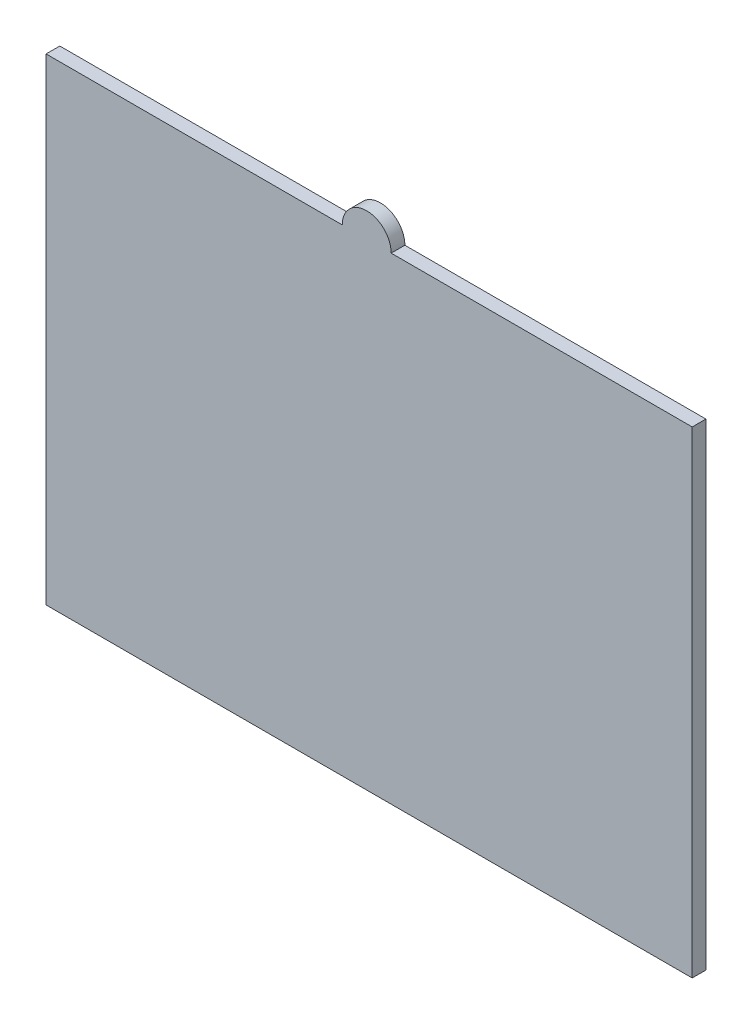
ISO-10303-21;
HEADER;
FILE_DESCRIPTION(('STEP AP214'),'2;1');
FILE_NAME('part.step','',(''),(''),'','','');
FILE_SCHEMA(('AUTOMOTIVE_DESIGN { 1 0 10303 214 1 1 1 1 }'));
ENDSEC;
DATA;
#1=APPLICATION_CONTEXT('core data for automotive mechanical design processes');
#2=APPLICATION_PROTOCOL_DEFINITION('international standard','automotive_design',2000,#1);
#3=PRODUCT_CONTEXT('',#1,'mechanical');
#4=PRODUCT('Part','Part','',(#3));
#5=PRODUCT_RELATED_PRODUCT_CATEGORY('part','',(#4));
#6=PRODUCT_DEFINITION_FORMATION('','',#4);
#7=PRODUCT_DEFINITION_CONTEXT('part definition',#1,'design');
#8=PRODUCT_DEFINITION('design','',#6,#7);
#9=PRODUCT_DEFINITION_SHAPE('','',#8);
#10=(LENGTH_UNIT() NAMED_UNIT(*) SI_UNIT(.MILLI.,.METRE.));
#11=(NAMED_UNIT(*) PLANE_ANGLE_UNIT() SI_UNIT($,.RADIAN.));
#12=(NAMED_UNIT(*) SI_UNIT($,.STERADIAN.) SOLID_ANGLE_UNIT());
#13=UNCERTAINTY_MEASURE_WITH_UNIT(LENGTH_MEASURE(1.E-05),#10,'distance_accuracy_value','');
#14=(GEOMETRIC_REPRESENTATION_CONTEXT(3) GLOBAL_UNCERTAINTY_ASSIGNED_CONTEXT((#13)) GLOBAL_UNIT_ASSIGNED_CONTEXT((#10,
#11,#12)) REPRESENTATION_CONTEXT('',''));
#15=CARTESIAN_POINT('',(0.,0.,0.));
#16=DIRECTION('',(0.,0.,1.));
#17=DIRECTION('',(1.,0.,0.));
#18=AXIS2_PLACEMENT_3D('',#15,#16,#17);
#19=CARTESIAN_POINT('',(66.5,48.5,2.8));
#20=DIRECTION('',(-1.,0.,0.));
#21=DIRECTION('',(0.,-1.,0.));
#22=AXIS2_PLACEMENT_3D('',#19,#20,#21);
#23=PLANE('',#22);
#24=DIRECTION('',(0.,1.,0.));
#25=VECTOR('',#24,1.);
#26=CARTESIAN_POINT('',(66.5,48.5,0.));
#27=LINE('',#26,#25);
#28=CARTESIAN_POINT('',(66.5,-49.,0.));
#29=VERTEX_POINT('',#28);
#30=CARTESIAN_POINT('',(66.5,48.5,0.));
#31=VERTEX_POINT('',#30);
#32=EDGE_CURVE('E132',#29,#31,#27,.T.);
#33=ORIENTED_EDGE('',*,*,#32,.T.);
#34=DIRECTION('',(0.,0.,-1.));
#35=VECTOR('',#34,1.);
#36=CARTESIAN_POINT('',(66.5,48.5,2.8));
#37=LINE('',#36,#35);
#38=CARTESIAN_POINT('',(66.5,48.5,2.8));
#39=VERTEX_POINT('',#38);
#40=EDGE_CURVE('E11',#39,#31,#37,.T.);
#41=ORIENTED_EDGE('',*,*,#40,.F.);
#42=DIRECTION('',(0.,1.,0.));
#43=VECTOR('',#42,1.);
#44=CARTESIAN_POINT('',(66.5,48.5,2.8));
#45=LINE('',#44,#43);
#46=CARTESIAN_POINT('',(66.5,-49.,2.8));
#47=VERTEX_POINT('',#46);
#48=EDGE_CURVE('E148',#47,#39,#45,.T.);
#49=ORIENTED_EDGE('',*,*,#48,.F.);
#50=DIRECTION('',(0.,0.,-1.));
#51=VECTOR('',#50,1.);
#52=CARTESIAN_POINT('',(66.5,-49.,2.8));
#53=LINE('',#52,#51);
#54=EDGE_CURVE('E128',#47,#29,#53,.T.);
#55=ORIENTED_EDGE('',*,*,#54,.T.);
#56=EDGE_LOOP('',(#33,#41,#49,#55));
#57=FACE_BOUND('',#56,.T.);
#58=ADVANCED_FACE('F43',(#57),#23,.F.);
#59=CARTESIAN_POINT('',(5.,48.5,2.8));
#60=DIRECTION('',(0.,-1.,0.));
#61=DIRECTION('',(0.,0.,-1.));
#62=AXIS2_PLACEMENT_3D('',#59,#60,#61);
#63=PLANE('',#62);
#64=DIRECTION('',(-1.,0.,0.));
#65=VECTOR('',#64,1.);
#66=CARTESIAN_POINT('',(5.,48.5,0.));
#67=LINE('',#66,#65);
#68=CARTESIAN_POINT('',(5.,48.5,0.));
#69=VERTEX_POINT('',#68);
#70=EDGE_CURVE('E136',#31,#69,#67,.T.);
#71=ORIENTED_EDGE('',*,*,#70,.T.);
#72=DIRECTION('',(0.,0.,-1.));
#73=VECTOR('',#72,1.);
#74=CARTESIAN_POINT('',(5.,48.5,2.8));
#75=LINE('',#74,#73);
#76=CARTESIAN_POINT('',(5.,48.5,2.8));
#77=VERTEX_POINT('',#76);
#78=EDGE_CURVE('E52',#77,#69,#75,.T.);
#79=ORIENTED_EDGE('',*,*,#78,.F.);
#80=DIRECTION('',(-1.,0.,0.));
#81=VECTOR('',#80,1.);
#82=CARTESIAN_POINT('',(5.,48.5,2.8));
#83=LINE('',#82,#81);
#84=EDGE_CURVE('E97',#39,#77,#83,.T.);
#85=ORIENTED_EDGE('',*,*,#84,.F.);
#86=ORIENTED_EDGE('',*,*,#40,.T.);
#87=EDGE_LOOP('',(#71,#79,#85,#86));
#88=FACE_BOUND('',#87,.T.);
#89=ADVANCED_FACE('F176',(#88),#63,.F.);
#90=CARTESIAN_POINT('',(0.,48.5,2.8));
#91=DIRECTION('',(0.,0.,-1.));
#92=DIRECTION('',(-1.,0.,0.));
#93=AXIS2_PLACEMENT_3D('',#90,#91,#92);
#94=CYLINDRICAL_SURFACE('',#93,5.);
#95=CARTESIAN_POINT('',(0.,48.5,0.));
#96=DIRECTION('',(0.,0.,1.));
#97=DIRECTION('',(1.,0.,0.));
#98=AXIS2_PLACEMENT_3D('',#95,#96,#97);
#99=CIRCLE('',#98,5.);
#100=CARTESIAN_POINT('',(-5.,48.5,0.));
#101=VERTEX_POINT('',#100);
#102=EDGE_CURVE('E139',#69,#101,#99,.T.);
#103=ORIENTED_EDGE('',*,*,#102,.T.);
#104=DIRECTION('',(0.,0.,-1.));
#105=VECTOR('',#104,1.);
#106=CARTESIAN_POINT('',(-5.,48.5,2.8));
#107=LINE('',#106,#105);
#108=CARTESIAN_POINT('',(-5.,48.5,2.8));
#109=VERTEX_POINT('',#108);
#110=EDGE_CURVE('E121',#109,#101,#107,.T.);
#111=ORIENTED_EDGE('',*,*,#110,.F.);
#112=CARTESIAN_POINT('',(0.,48.5,2.8));
#113=DIRECTION('',(0.,0.,1.));
#114=DIRECTION('',(1.,0.,0.));
#115=AXIS2_PLACEMENT_3D('',#112,#113,#114);
#116=CIRCLE('',#115,5.);
#117=EDGE_CURVE('E110',#77,#109,#116,.T.);
#118=ORIENTED_EDGE('',*,*,#117,.F.);
#119=ORIENTED_EDGE('',*,*,#78,.T.);
#120=EDGE_LOOP('',(#103,#111,#118,#119));
#121=FACE_BOUND('',#120,.T.);
#122=ADVANCED_FACE('F158',(#121),#94,.T.);
#123=CARTESIAN_POINT('',(-65.5,48.5,2.8));
#124=DIRECTION('',(0.,-1.,0.));
#125=DIRECTION('',(0.,0.,-1.));
#126=AXIS2_PLACEMENT_3D('',#123,#124,#125);
#127=PLANE('',#126);
#128=DIRECTION('',(-1.,0.,0.));
#129=VECTOR('',#128,1.);
#130=CARTESIAN_POINT('',(-65.5,48.5,0.));
#131=LINE('',#130,#129);
#132=CARTESIAN_POINT('',(-65.5,48.5,0.));
#133=VERTEX_POINT('',#132);
#134=EDGE_CURVE('E119',#101,#133,#131,.T.);
#135=ORIENTED_EDGE('',*,*,#134,.T.);
#136=DIRECTION('',(0.,0.,-1.));
#137=VECTOR('',#136,1.);
#138=CARTESIAN_POINT('',(-65.5,48.5,2.8));
#139=LINE('',#138,#137);
#140=CARTESIAN_POINT('',(-65.5,48.5,2.8));
#141=VERTEX_POINT('',#140);
#142=EDGE_CURVE('E116',#141,#133,#139,.T.);
#143=ORIENTED_EDGE('',*,*,#142,.F.);
#144=DIRECTION('',(-1.,0.,0.));
#145=VECTOR('',#144,1.);
#146=CARTESIAN_POINT('',(-65.5,48.5,2.8));
#147=LINE('',#146,#145);
#148=EDGE_CURVE('E104',#109,#141,#147,.T.);
#149=ORIENTED_EDGE('',*,*,#148,.F.);
#150=ORIENTED_EDGE('',*,*,#110,.T.);
#151=EDGE_LOOP('',(#135,#143,#149,#150));
#152=FACE_BOUND('',#151,.T.);
#153=ADVANCED_FACE('F117',(#152),#127,.F.);
#154=CARTESIAN_POINT('',(-65.5,48.5,2.8));
#155=DIRECTION('',(1.,0.,0.));
#156=DIRECTION('',(0.,1.,0.));
#157=AXIS2_PLACEMENT_3D('',#154,#155,#156);
#158=PLANE('',#157);
#159=DIRECTION('',(0.,-1.,0.));
#160=VECTOR('',#159,1.);
#161=CARTESIAN_POINT('',(-65.5,48.5,0.));
#162=LINE('',#161,#160);
#163=CARTESIAN_POINT('',(-65.5,-49.,0.));
#164=VERTEX_POINT('',#163);
#165=EDGE_CURVE('E83',#133,#164,#162,.T.);
#166=ORIENTED_EDGE('',*,*,#165,.T.);
#167=DIRECTION('',(0.,0.,-1.));
#168=VECTOR('',#167,1.);
#169=CARTESIAN_POINT('',(-65.5,-49.,2.8));
#170=LINE('',#169,#168);
#171=CARTESIAN_POINT('',(-65.5,-49.,2.8));
#172=VERTEX_POINT('',#171);
#173=EDGE_CURVE('E122',#172,#164,#170,.T.);
#174=ORIENTED_EDGE('',*,*,#173,.F.);
#175=DIRECTION('',(0.,-1.,0.));
#176=VECTOR('',#175,1.);
#177=CARTESIAN_POINT('',(-65.5,48.5,2.8));
#178=LINE('',#177,#176);
#179=EDGE_CURVE('E108',#141,#172,#178,.T.);
#180=ORIENTED_EDGE('',*,*,#179,.F.);
#181=ORIENTED_EDGE('',*,*,#142,.T.);
#182=EDGE_LOOP('',(#166,#174,#180,#181));
#183=FACE_BOUND('',#182,.T.);
#184=ADVANCED_FACE('F124',(#183),#158,.F.);
#185=CARTESIAN_POINT('',(-65.5,-49.,2.8));
#186=DIRECTION('',(0.,1.,0.));
#187=DIRECTION('',(0.,0.,1.));
#188=AXIS2_PLACEMENT_3D('',#185,#186,#187);
#189=PLANE('',#188);
#190=DIRECTION('',(1.,0.,0.));
#191=VECTOR('',#190,1.);
#192=CARTESIAN_POINT('',(-65.5,-49.,0.));
#193=LINE('',#192,#191);
#194=EDGE_CURVE('E89',#164,#29,#193,.T.);
#195=ORIENTED_EDGE('',*,*,#194,.T.);
#196=ORIENTED_EDGE('',*,*,#54,.F.);
#197=DIRECTION('',(1.,0.,0.));
#198=VECTOR('',#197,1.);
#199=CARTESIAN_POINT('',(-65.5,-49.,2.8));
#200=LINE('',#199,#198);
#201=EDGE_CURVE('E60',#172,#47,#200,.T.);
#202=ORIENTED_EDGE('',*,*,#201,.F.);
#203=ORIENTED_EDGE('',*,*,#173,.T.);
#204=EDGE_LOOP('',(#195,#196,#202,#203));
#205=FACE_BOUND('',#204,.T.);
#206=ADVANCED_FACE('F165',(#205),#189,.F.);
#207=CARTESIAN_POINT('',(0.,48.5,2.8));
#208=DIRECTION('',(0.,0.,1.));
#209=DIRECTION('',(1.,0.,0.));
#210=AXIS2_PLACEMENT_3D('',#207,#208,#209);
#211=PLANE('',#210);
#212=ORIENTED_EDGE('',*,*,#48,.T.);
#213=ORIENTED_EDGE('',*,*,#84,.T.);
#214=ORIENTED_EDGE('',*,*,#117,.T.);
#215=ORIENTED_EDGE('',*,*,#148,.T.);
#216=ORIENTED_EDGE('',*,*,#179,.T.);
#217=ORIENTED_EDGE('',*,*,#201,.T.);
#218=EDGE_LOOP('',(#212,#213,#214,#215,#216,#217));
#219=FACE_BOUND('',#218,.T.);
#220=ADVANCED_FACE('F106',(#219),#211,.T.);
#221=CARTESIAN_POINT('',(0.,48.5,0.));
#222=DIRECTION('',(0.,0.,1.));
#223=DIRECTION('',(1.,0.,0.));
#224=AXIS2_PLACEMENT_3D('',#221,#222,#223);
#225=PLANE('',#224);
#226=ORIENTED_EDGE('',*,*,#32,.F.);
#227=ORIENTED_EDGE('',*,*,#194,.F.);
#228=ORIENTED_EDGE('',*,*,#165,.F.);
#229=ORIENTED_EDGE('',*,*,#134,.F.);
#230=ORIENTED_EDGE('',*,*,#102,.F.);
#231=ORIENTED_EDGE('',*,*,#70,.F.);
#232=EDGE_LOOP('',(#226,#227,#228,#229,#230,#231));
#233=FACE_BOUND('',#232,.T.);
#234=ADVANCED_FACE('F161',(#233),#225,.F.);
#235=CLOSED_SHELL('',(#58,#89,#122,#153,#184,#206,#220,#234));
#236=MANIFOLD_SOLID_BREP('B2',#235);
#237=ADVANCED_BREP_SHAPE_REPRESENTATION('',(#18,#236),#14);
#238=SHAPE_DEFINITION_REPRESENTATION(#9,#237);
ENDSEC;
END-ISO-10303-21;
